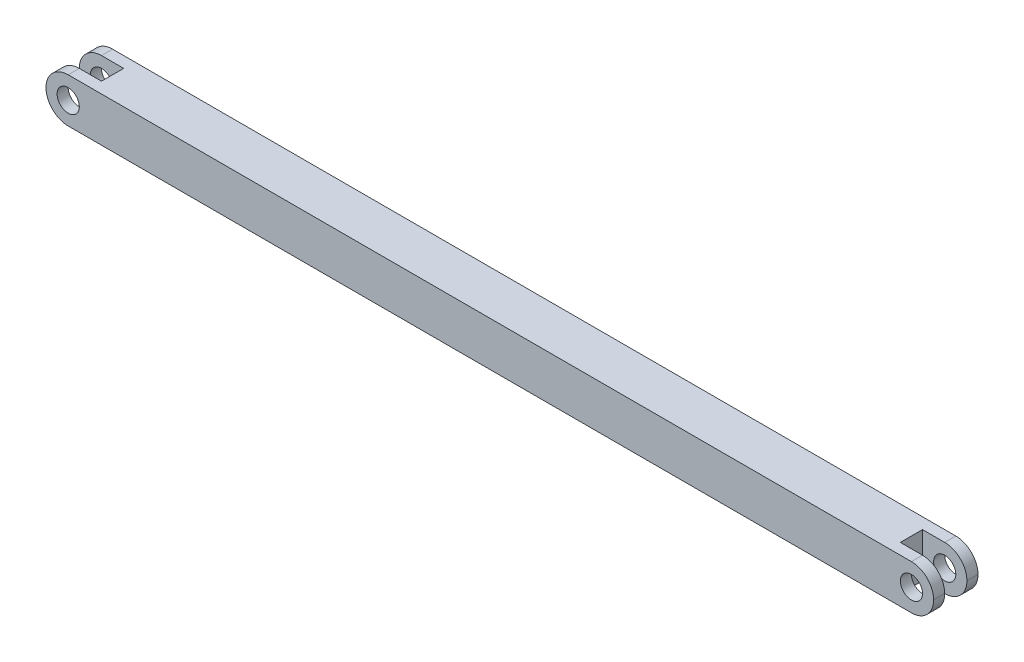
ISO-10303-21;
HEADER;
FILE_DESCRIPTION(('STEP AP214'),'2;1');
FILE_NAME('part.step','',(''),(''),'','','');
FILE_SCHEMA(('AUTOMOTIVE_DESIGN { 1 0 10303 214 1 1 1 1 }'));
ENDSEC;
DATA;
#1=APPLICATION_CONTEXT('core data for automotive mechanical design processes');
#2=APPLICATION_PROTOCOL_DEFINITION('international standard','automotive_design',2000,#1);
#3=PRODUCT_CONTEXT('',#1,'mechanical');
#4=PRODUCT('Part','Part','',(#3));
#5=PRODUCT_RELATED_PRODUCT_CATEGORY('part','',(#4));
#6=PRODUCT_DEFINITION_FORMATION('','',#4);
#7=PRODUCT_DEFINITION_CONTEXT('part definition',#1,'design');
#8=PRODUCT_DEFINITION('design','',#6,#7);
#9=PRODUCT_DEFINITION_SHAPE('','',#8);
#10=(LENGTH_UNIT() NAMED_UNIT(*) SI_UNIT(.MILLI.,.METRE.));
#11=(NAMED_UNIT(*) PLANE_ANGLE_UNIT() SI_UNIT($,.RADIAN.));
#12=(NAMED_UNIT(*) SI_UNIT($,.STERADIAN.) SOLID_ANGLE_UNIT());
#13=UNCERTAINTY_MEASURE_WITH_UNIT(LENGTH_MEASURE(1.E-05),#10,'distance_accuracy_value','');
#14=(GEOMETRIC_REPRESENTATION_CONTEXT(3) GLOBAL_UNCERTAINTY_ASSIGNED_CONTEXT((#13)) GLOBAL_UNIT_ASSIGNED_CONTEXT((#10,
#11,#12)) REPRESENTATION_CONTEXT('',''));
#15=CARTESIAN_POINT('',(0.,0.,0.));
#16=DIRECTION('',(0.,0.,1.));
#17=DIRECTION('',(1.,0.,0.));
#18=AXIS2_PLACEMENT_3D('',#15,#16,#17);
#19=CARTESIAN_POINT('',(-95.,0.,10.));
#20=DIRECTION('',(0.,0.,-1.));
#21=DIRECTION('',(-1.,0.,0.));
#22=AXIS2_PLACEMENT_3D('',#19,#20,#21);
#23=CYLINDRICAL_SURFACE('',#22,5.);
#24=CARTESIAN_POINT('',(-95.,0.,2.5));
#25=DIRECTION('',(0.,0.,-1.));
#26=DIRECTION('',(-1.,0.,0.));
#27=AXIS2_PLACEMENT_3D('',#24,#25,#26);
#28=CIRCLE('',#27,5.);
#29=CARTESIAN_POINT('',(-95.,5.,2.5));
#30=VERTEX_POINT('',#29);
#31=CARTESIAN_POINT('',(-100.,0.,2.5));
#32=VERTEX_POINT('',#31);
#33=EDGE_CURVE('E216',#30,#32,#28,.F.);
#34=ORIENTED_EDGE('',*,*,#33,.F.);
#35=DIRECTION('',(0.,0.,-1.));
#36=VECTOR('',#35,1.);
#37=CARTESIAN_POINT('',(-95.,5.,10.));
#38=LINE('',#37,#36);
#39=CARTESIAN_POINT('',(-95.,5.,0.));
#40=VERTEX_POINT('',#39);
#41=EDGE_CURVE('E11',#40,#30,#38,.F.);
#42=ORIENTED_EDGE('',*,*,#41,.F.);
#43=CARTESIAN_POINT('',(-95.,0.,0.));
#44=DIRECTION('',(0.,0.,1.));
#45=DIRECTION('',(1.,0.,0.));
#46=AXIS2_PLACEMENT_3D('',#43,#44,#45);
#47=CIRCLE('',#46,5.);
#48=CARTESIAN_POINT('',(-100.,0.,0.));
#49=VERTEX_POINT('',#48);
#50=EDGE_CURVE('E254',#49,#40,#47,.F.);
#51=ORIENTED_EDGE('',*,*,#50,.F.);
#52=DIRECTION('',(0.,0.,-1.));
#53=VECTOR('',#52,1.);
#54=CARTESIAN_POINT('',(-100.,0.,10.));
#55=LINE('',#54,#53);
#56=EDGE_CURVE('E274',#32,#49,#55,.T.);
#57=ORIENTED_EDGE('',*,*,#56,.F.);
#58=EDGE_LOOP('',(#34,#42,#51,#57));
#59=FACE_BOUND('',#58,.T.);
#60=ADVANCED_FACE('F33',(#59),#23,.T.);
#61=CARTESIAN_POINT('',(-95.,0.,10.));
#62=DIRECTION('',(0.,0.,-1.));
#63=DIRECTION('',(-1.,0.,0.));
#64=AXIS2_PLACEMENT_3D('',#61,#62,#63);
#65=CYLINDRICAL_SURFACE('',#64,5.);
#66=CARTESIAN_POINT('',(-95.,0.,2.5));
#67=DIRECTION('',(0.,0.,-1.));
#68=DIRECTION('',(-1.,0.,0.));
#69=AXIS2_PLACEMENT_3D('',#66,#67,#68);
#70=CIRCLE('',#69,5.);
#71=CARTESIAN_POINT('',(-95.,-5.,2.5));
#72=VERTEX_POINT('',#71);
#73=EDGE_CURVE('E214',#32,#72,#70,.F.);
#74=ORIENTED_EDGE('',*,*,#73,.F.);
#75=ORIENTED_EDGE('',*,*,#56,.T.);
#76=CARTESIAN_POINT('',(-95.,0.,0.));
#77=DIRECTION('',(0.,0.,1.));
#78=DIRECTION('',(1.,0.,0.));
#79=AXIS2_PLACEMENT_3D('',#76,#77,#78);
#80=CIRCLE('',#79,5.);
#81=CARTESIAN_POINT('',(-95.,-5.,0.));
#82=VERTEX_POINT('',#81);
#83=EDGE_CURVE('E256',#82,#49,#80,.F.);
#84=ORIENTED_EDGE('',*,*,#83,.F.);
#85=DIRECTION('',(0.,0.,-1.));
#86=VECTOR('',#85,1.);
#87=CARTESIAN_POINT('',(-95.,-5.,10.));
#88=LINE('',#87,#86);
#89=EDGE_CURVE('E248',#72,#82,#88,.T.);
#90=ORIENTED_EDGE('',*,*,#89,.F.);
#91=EDGE_LOOP('',(#74,#75,#84,#90));
#92=FACE_BOUND('',#91,.T.);
#93=ADVANCED_FACE('F299',(#92),#65,.T.);
#94=CARTESIAN_POINT('',(95.,0.,10.));
#95=DIRECTION('',(0.,0.,-1.));
#96=DIRECTION('',(-1.,0.,0.));
#97=AXIS2_PLACEMENT_3D('',#94,#95,#96);
#98=CYLINDRICAL_SURFACE('',#97,5.);
#99=CARTESIAN_POINT('',(95.,0.,2.50000000000079));
#100=DIRECTION('',(0.,0.,-1.));
#101=DIRECTION('',(-1.,0.,0.));
#102=AXIS2_PLACEMENT_3D('',#99,#100,#101);
#103=CIRCLE('',#102,5.);
#104=CARTESIAN_POINT('',(100.,0.,2.50000000000083));
#105=VERTEX_POINT('',#104);
#106=CARTESIAN_POINT('',(95.,5.,2.50000000000079));
#107=VERTEX_POINT('',#106);
#108=EDGE_CURVE('E207',#105,#107,#103,.F.);
#109=ORIENTED_EDGE('',*,*,#108,.F.);
#110=DIRECTION('',(0.,0.,-1.));
#111=VECTOR('',#110,1.);
#112=CARTESIAN_POINT('',(100.,0.,10.));
#113=LINE('',#112,#111);
#114=CARTESIAN_POINT('',(100.,0.,0.));
#115=VERTEX_POINT('',#114);
#116=EDGE_CURVE('E275',#115,#105,#113,.F.);
#117=ORIENTED_EDGE('',*,*,#116,.F.);
#118=CARTESIAN_POINT('',(95.,0.,0.));
#119=DIRECTION('',(0.,0.,1.));
#120=DIRECTION('',(1.,0.,0.));
#121=AXIS2_PLACEMENT_3D('',#118,#119,#120);
#122=CIRCLE('',#121,5.);
#123=CARTESIAN_POINT('',(94.9999999999999,5.,0.));
#124=VERTEX_POINT('',#123);
#125=EDGE_CURVE('E250',#124,#115,#122,.F.);
#126=ORIENTED_EDGE('',*,*,#125,.F.);
#127=DIRECTION('',(0.,0.,-1.));
#128=VECTOR('',#127,1.);
#129=CARTESIAN_POINT('',(95.,5.,10.));
#130=LINE('',#129,#128);
#131=EDGE_CURVE('E268',#107,#124,#130,.T.);
#132=ORIENTED_EDGE('',*,*,#131,.F.);
#133=EDGE_LOOP('',(#109,#117,#126,#132));
#134=FACE_BOUND('',#133,.T.);
#135=ADVANCED_FACE('F306',(#134),#98,.T.);
#136=CARTESIAN_POINT('',(95.,0.,10.));
#137=DIRECTION('',(0.,0.,-1.));
#138=DIRECTION('',(-1.,0.,0.));
#139=AXIS2_PLACEMENT_3D('',#136,#137,#138);
#140=CYLINDRICAL_SURFACE('',#139,5.);
#141=CARTESIAN_POINT('',(95.,0.,2.50000000000079));
#142=DIRECTION('',(0.,0.,-1.));
#143=DIRECTION('',(-1.,0.,0.));
#144=AXIS2_PLACEMENT_3D('',#141,#142,#143);
#145=CIRCLE('',#144,5.);
#146=CARTESIAN_POINT('',(95.,-5.,2.50000000000079));
#147=VERTEX_POINT('',#146);
#148=EDGE_CURVE('E205',#147,#105,#145,.F.);
#149=ORIENTED_EDGE('',*,*,#148,.F.);
#150=DIRECTION('',(0.,0.,-1.));
#151=VECTOR('',#150,1.);
#152=CARTESIAN_POINT('',(95.,-5.,10.));
#153=LINE('',#152,#151);
#154=CARTESIAN_POINT('',(94.9999999999999,-5.,0.));
#155=VERTEX_POINT('',#154);
#156=EDGE_CURVE('E245',#155,#147,#153,.F.);
#157=ORIENTED_EDGE('',*,*,#156,.F.);
#158=CARTESIAN_POINT('',(95.,0.,0.));
#159=DIRECTION('',(0.,0.,1.));
#160=DIRECTION('',(1.,0.,0.));
#161=AXIS2_PLACEMENT_3D('',#158,#159,#160);
#162=CIRCLE('',#161,5.);
#163=EDGE_CURVE('E252',#115,#155,#162,.F.);
#164=ORIENTED_EDGE('',*,*,#163,.F.);
#165=ORIENTED_EDGE('',*,*,#116,.T.);
#166=EDGE_LOOP('',(#149,#157,#164,#165));
#167=FACE_BOUND('',#166,.T.);
#168=ADVANCED_FACE('F357',(#167),#140,.T.);
#169=CARTESIAN_POINT('',(-95.,0.,0.));
#170=DIRECTION('',(0.,0.,1.));
#171=DIRECTION('',(1.,0.,0.));
#172=AXIS2_PLACEMENT_3D('',#169,#170,#171);
#173=CYLINDRICAL_SURFACE('',#172,2.5);
#174=CARTESIAN_POINT('',(-95.,0.,2.5));
#175=DIRECTION('',(0.,0.,-1.));
#176=DIRECTION('',(-1.,0.,0.));
#177=AXIS2_PLACEMENT_3D('',#174,#175,#176);
#178=CIRCLE('',#177,2.5);
#179=CARTESIAN_POINT('',(-97.5,0.,2.5));
#180=VERTEX_POINT('',#179);
#181=EDGE_CURVE('E37',#180,#180,#178,.F.);
#182=ORIENTED_EDGE('',*,*,#181,.T.);
#183=EDGE_LOOP('',(#182));
#184=FACE_BOUND('',#183,.T.);
#185=CARTESIAN_POINT('',(-95.,0.,0.));
#186=DIRECTION('',(0.,0.,1.));
#187=DIRECTION('',(1.,0.,0.));
#188=AXIS2_PLACEMENT_3D('',#185,#186,#187);
#189=CIRCLE('',#188,2.5);
#190=CARTESIAN_POINT('',(-92.5,0.,0.));
#191=VERTEX_POINT('',#190);
#192=EDGE_CURVE('E226',#191,#191,#189,.T.);
#193=ORIENTED_EDGE('',*,*,#192,.F.);
#194=EDGE_LOOP('',(#193));
#195=FACE_BOUND('',#194,.T.);
#196=ADVANCED_FACE('F387',(#184,#195),#173,.F.);
#197=CARTESIAN_POINT('',(95.,0.,0.));
#198=DIRECTION('',(0.,0.,1.));
#199=DIRECTION('',(1.,0.,0.));
#200=AXIS2_PLACEMENT_3D('',#197,#198,#199);
#201=CYLINDRICAL_SURFACE('',#200,2.5);
#202=CARTESIAN_POINT('',(95.,0.,2.50000000000079));
#203=DIRECTION('',(0.,0.,-1.));
#204=DIRECTION('',(-1.,0.,0.));
#205=AXIS2_PLACEMENT_3D('',#202,#203,#204);
#206=CIRCLE('',#205,2.5);
#207=CARTESIAN_POINT('',(92.5,0.,2.50000000000077));
#208=VERTEX_POINT('',#207);
#209=EDGE_CURVE('E204',#208,#208,#206,.F.);
#210=ORIENTED_EDGE('',*,*,#209,.T.);
#211=EDGE_LOOP('',(#210));
#212=FACE_BOUND('',#211,.T.);
#213=CARTESIAN_POINT('',(95.,0.,0.));
#214=DIRECTION('',(0.,0.,1.));
#215=DIRECTION('',(1.,0.,0.));
#216=AXIS2_PLACEMENT_3D('',#213,#214,#215);
#217=CIRCLE('',#216,2.5);
#218=CARTESIAN_POINT('',(97.5,0.,0.));
#219=VERTEX_POINT('',#218);
#220=EDGE_CURVE('E219',#219,#219,#217,.T.);
#221=ORIENTED_EDGE('',*,*,#220,.F.);
#222=EDGE_LOOP('',(#221));
#223=FACE_BOUND('',#222,.T.);
#224=ADVANCED_FACE('F378',(#212,#223),#201,.F.);
#225=CARTESIAN_POINT('',(-100.,5.,10.));
#226=DIRECTION('',(0.,-1.,0.));
#227=DIRECTION('',(0.,0.,-1.));
#228=AXIS2_PLACEMENT_3D('',#225,#226,#227);
#229=PLANE('',#228);
#230=ORIENTED_EDGE('',*,*,#41,.T.);
#231=DIRECTION('',(-1.,0.,0.));
#232=VECTOR('',#231,1.);
#233=CARTESIAN_POINT('',(-100.,5.,2.5));
#234=LINE('',#233,#232);
#235=CARTESIAN_POINT('',(-90.,5.,2.5));
#236=VERTEX_POINT('',#235);
#237=EDGE_CURVE('E170',#236,#30,#234,.T.);
#238=ORIENTED_EDGE('',*,*,#237,.F.);
#239=DIRECTION('',(0.,0.,-1.));
#240=VECTOR('',#239,1.);
#241=CARTESIAN_POINT('',(-90.,5.,2.5));
#242=LINE('',#241,#240);
#243=CARTESIAN_POINT('',(-90.,5.,7.5));
#244=VERTEX_POINT('',#243);
#245=EDGE_CURVE('E172',#244,#236,#242,.T.);
#246=ORIENTED_EDGE('',*,*,#245,.F.);
#247=DIRECTION('',(1.,0.,0.));
#248=VECTOR('',#247,1.);
#249=CARTESIAN_POINT('',(-100.,5.,7.5));
#250=LINE('',#249,#248);
#251=CARTESIAN_POINT('',(-95.,5.,7.5));
#252=VERTEX_POINT('',#251);
#253=EDGE_CURVE('E151',#252,#244,#250,.T.);
#254=ORIENTED_EDGE('',*,*,#253,.F.);
#255=CARTESIAN_POINT('',(-95.,5.,10.));
#256=VERTEX_POINT('',#255);
#257=EDGE_CURVE('E42',#252,#256,#38,.F.);
#258=ORIENTED_EDGE('',*,*,#257,.T.);
#259=DIRECTION('',(-1.,0.,0.));
#260=VECTOR('',#259,1.);
#261=CARTESIAN_POINT('',(-100.,5.,10.));
#262=LINE('',#261,#260);
#263=CARTESIAN_POINT('',(94.9999999999999,5.,10.));
#264=VERTEX_POINT('',#263);
#265=EDGE_CURVE('E231',#264,#256,#262,.T.);
#266=ORIENTED_EDGE('',*,*,#265,.F.);
#267=CARTESIAN_POINT('',(95.,5.,7.50000000000079));
#268=VERTEX_POINT('',#267);
#269=EDGE_CURVE('E269',#264,#268,#130,.T.);
#270=ORIENTED_EDGE('',*,*,#269,.T.);
#271=DIRECTION('',(1.,0.,0.));
#272=VECTOR('',#271,1.);
#273=CARTESIAN_POINT('',(99.9999999999999,5.,7.50000000000083));
#274=LINE('',#273,#272);
#275=CARTESIAN_POINT('',(90.,5.,7.50000000000075));
#276=VERTEX_POINT('',#275);
#277=EDGE_CURVE('E185',#276,#268,#274,.T.);
#278=ORIENTED_EDGE('',*,*,#277,.F.);
#279=DIRECTION('',(0.,0.,1.));
#280=VECTOR('',#279,1.);
#281=CARTESIAN_POINT('',(90.,5.,2.50000000000075));
#282=LINE('',#281,#280);
#283=CARTESIAN_POINT('',(90.,5.,2.50000000000075));
#284=VERTEX_POINT('',#283);
#285=EDGE_CURVE('E194',#284,#276,#282,.T.);
#286=ORIENTED_EDGE('',*,*,#285,.F.);
#287=DIRECTION('',(-1.,0.,0.));
#288=VECTOR('',#287,1.);
#289=CARTESIAN_POINT('',(100.,5.,2.50000000000083));
#290=LINE('',#289,#288);
#291=EDGE_CURVE('E192',#107,#284,#290,.T.);
#292=ORIENTED_EDGE('',*,*,#291,.F.);
#293=ORIENTED_EDGE('',*,*,#131,.T.);
#294=DIRECTION('',(-1.,0.,0.));
#295=VECTOR('',#294,1.);
#296=CARTESIAN_POINT('',(-100.,5.,0.));
#297=LINE('',#296,#295);
#298=EDGE_CURVE('E239',#124,#40,#297,.T.);
#299=ORIENTED_EDGE('',*,*,#298,.T.);
#300=EDGE_LOOP('',(#230,#238,#246,#254,#258,#266,#270,#278,#286,#292,#293,#299));
#301=FACE_BOUND('',#300,.T.);
#302=ADVANCED_FACE('F340',(#301),#229,.F.);
#303=CARTESIAN_POINT('',(-100.,-5.,10.));
#304=DIRECTION('',(0.,1.,0.));
#305=DIRECTION('',(0.,0.,1.));
#306=AXIS2_PLACEMENT_3D('',#303,#304,#305);
#307=PLANE('',#306);
#308=DIRECTION('',(0.,0.,-1.));
#309=VECTOR('',#308,1.);
#310=CARTESIAN_POINT('',(-90.,-5.,2.5));
#311=LINE('',#310,#309);
#312=CARTESIAN_POINT('',(-90.,-5.,7.5));
#313=VERTEX_POINT('',#312);
#314=CARTESIAN_POINT('',(-90.,-5.,2.5));
#315=VERTEX_POINT('',#314);
#316=EDGE_CURVE('E159',#313,#315,#311,.T.);
#317=ORIENTED_EDGE('',*,*,#316,.T.);
#318=DIRECTION('',(-1.,0.,0.));
#319=VECTOR('',#318,1.);
#320=CARTESIAN_POINT('',(-100.,-5.,2.5));
#321=LINE('',#320,#319);
#322=EDGE_CURVE('E156',#315,#72,#321,.T.);
#323=ORIENTED_EDGE('',*,*,#322,.T.);
#324=ORIENTED_EDGE('',*,*,#89,.T.);
#325=DIRECTION('',(1.,0.,0.));
#326=VECTOR('',#325,1.);
#327=CARTESIAN_POINT('',(-100.,-5.,0.));
#328=LINE('',#327,#326);
#329=EDGE_CURVE('E235',#82,#155,#328,.T.);
#330=ORIENTED_EDGE('',*,*,#329,.T.);
#331=ORIENTED_EDGE('',*,*,#156,.T.);
#332=DIRECTION('',(-1.,0.,0.));
#333=VECTOR('',#332,1.);
#334=CARTESIAN_POINT('',(100.,-5.,2.50000000000083));
#335=LINE('',#334,#333);
#336=CARTESIAN_POINT('',(90.,-5.,2.50000000000075));
#337=VERTEX_POINT('',#336);
#338=EDGE_CURVE('E181',#147,#337,#335,.T.);
#339=ORIENTED_EDGE('',*,*,#338,.T.);
#340=DIRECTION('',(0.,0.,1.));
#341=VECTOR('',#340,1.);
#342=CARTESIAN_POINT('',(90.,-5.,2.50000000000075));
#343=LINE('',#342,#341);
#344=CARTESIAN_POINT('',(90.,-5.,7.50000000000075));
#345=VERTEX_POINT('',#344);
#346=EDGE_CURVE('E184',#337,#345,#343,.T.);
#347=ORIENTED_EDGE('',*,*,#346,.T.);
#348=DIRECTION('',(1.,0.,0.));
#349=VECTOR('',#348,1.);
#350=CARTESIAN_POINT('',(99.9999999999999,-5.,7.50000000000083));
#351=LINE('',#350,#349);
#352=CARTESIAN_POINT('',(95.,-5.,7.50000000000079));
#353=VERTEX_POINT('',#352);
#354=EDGE_CURVE('E188',#345,#353,#351,.T.);
#355=ORIENTED_EDGE('',*,*,#354,.T.);
#356=CARTESIAN_POINT('',(94.9999999999999,-5.,10.));
#357=VERTEX_POINT('',#356);
#358=EDGE_CURVE('E238',#353,#357,#153,.F.);
#359=ORIENTED_EDGE('',*,*,#358,.T.);
#360=DIRECTION('',(1.,0.,0.));
#361=VECTOR('',#360,1.);
#362=CARTESIAN_POINT('',(-100.,-5.,10.));
#363=LINE('',#362,#361);
#364=CARTESIAN_POINT('',(-95.,-5.,10.));
#365=VERTEX_POINT('',#364);
#366=EDGE_CURVE('E234',#365,#357,#363,.T.);
#367=ORIENTED_EDGE('',*,*,#366,.F.);
#368=CARTESIAN_POINT('',(-95.,-5.,7.5));
#369=VERTEX_POINT('',#368);
#370=EDGE_CURVE('E169',#365,#369,#88,.T.);
#371=ORIENTED_EDGE('',*,*,#370,.T.);
#372=DIRECTION('',(1.,0.,0.));
#373=VECTOR('',#372,1.);
#374=CARTESIAN_POINT('',(-100.,-5.,7.5));
#375=LINE('',#374,#373);
#376=EDGE_CURVE('E50',#369,#313,#375,.T.);
#377=ORIENTED_EDGE('',*,*,#376,.T.);
#378=EDGE_LOOP('',(#317,#323,#324,#330,#331,#339,#347,#355,#359,#367,#371,#377));
#379=FACE_BOUND('',#378,.T.);
#380=ADVANCED_FACE('F166',(#379),#307,.F.);
#381=CARTESIAN_POINT('',(0.,0.,10.));
#382=DIRECTION('',(0.,0.,1.));
#383=DIRECTION('',(1.,0.,0.));
#384=AXIS2_PLACEMENT_3D('',#381,#382,#383);
#385=PLANE('',#384);
#386=CARTESIAN_POINT('',(95.,0.,10.));
#387=DIRECTION('',(0.,0.,1.));
#388=DIRECTION('',(1.,0.,0.));
#389=AXIS2_PLACEMENT_3D('',#386,#387,#388);
#390=CIRCLE('',#389,2.5);
#391=CARTESIAN_POINT('',(97.5,0.,10.));
#392=VERTEX_POINT('',#391);
#393=EDGE_CURVE('E223',#392,#392,#390,.T.);
#394=ORIENTED_EDGE('',*,*,#393,.F.);
#395=EDGE_LOOP('',(#394));
#396=FACE_BOUND('',#395,.T.);
#397=CARTESIAN_POINT('',(-95.,0.,10.));
#398=DIRECTION('',(0.,0.,1.));
#399=DIRECTION('',(1.,0.,0.));
#400=AXIS2_PLACEMENT_3D('',#397,#398,#399);
#401=CIRCLE('',#400,2.5);
#402=CARTESIAN_POINT('',(-92.5,0.,10.));
#403=VERTEX_POINT('',#402);
#404=EDGE_CURVE('E218',#403,#403,#401,.T.);
#405=ORIENTED_EDGE('',*,*,#404,.F.);
#406=EDGE_LOOP('',(#405));
#407=FACE_BOUND('',#406,.T.);
#408=CARTESIAN_POINT('',(-95.,0.,10.));
#409=DIRECTION('',(0.,0.,1.));
#410=DIRECTION('',(1.,0.,0.));
#411=AXIS2_PLACEMENT_3D('',#408,#409,#410);
#412=CIRCLE('',#411,5.);
#413=CARTESIAN_POINT('',(-100.,0.,10.));
#414=VERTEX_POINT('',#413);
#415=EDGE_CURVE('E264',#256,#414,#412,.T.);
#416=ORIENTED_EDGE('',*,*,#415,.T.);
#417=CARTESIAN_POINT('',(-95.,0.,10.));
#418=DIRECTION('',(0.,0.,1.));
#419=DIRECTION('',(1.,0.,0.));
#420=AXIS2_PLACEMENT_3D('',#417,#418,#419);
#421=CIRCLE('',#420,5.);
#422=EDGE_CURVE('E266',#414,#365,#421,.T.);
#423=ORIENTED_EDGE('',*,*,#422,.T.);
#424=ORIENTED_EDGE('',*,*,#366,.T.);
#425=CARTESIAN_POINT('',(95.,0.,10.));
#426=DIRECTION('',(0.,0.,1.));
#427=DIRECTION('',(1.,0.,0.));
#428=AXIS2_PLACEMENT_3D('',#425,#426,#427);
#429=CIRCLE('',#428,5.);
#430=CARTESIAN_POINT('',(100.,0.,10.));
#431=VERTEX_POINT('',#430);
#432=EDGE_CURVE('E261',#357,#431,#429,.T.);
#433=ORIENTED_EDGE('',*,*,#432,.T.);
#434=CARTESIAN_POINT('',(95.,0.,10.));
#435=DIRECTION('',(0.,0.,1.));
#436=DIRECTION('',(1.,0.,0.));
#437=AXIS2_PLACEMENT_3D('',#434,#435,#436);
#438=CIRCLE('',#437,5.);
#439=EDGE_CURVE('E259',#431,#264,#438,.T.);
#440=ORIENTED_EDGE('',*,*,#439,.T.);
#441=ORIENTED_EDGE('',*,*,#265,.T.);
#442=EDGE_LOOP('',(#416,#423,#424,#433,#440,#441));
#443=FACE_BOUND('',#442,.T.);
#444=ADVANCED_FACE('F319',(#396,#407,#443),#385,.T.);
#445=CARTESIAN_POINT('',(0.,0.,0.));
#446=DIRECTION('',(0.,0.,1.));
#447=DIRECTION('',(1.,0.,0.));
#448=AXIS2_PLACEMENT_3D('',#445,#446,#447);
#449=PLANE('',#448);
#450=ORIENTED_EDGE('',*,*,#220,.T.);
#451=EDGE_LOOP('',(#450));
#452=FACE_BOUND('',#451,.T.);
#453=ORIENTED_EDGE('',*,*,#192,.T.);
#454=EDGE_LOOP('',(#453));
#455=FACE_BOUND('',#454,.T.);
#456=ORIENTED_EDGE('',*,*,#329,.F.);
#457=ORIENTED_EDGE('',*,*,#83,.T.);
#458=ORIENTED_EDGE('',*,*,#50,.T.);
#459=ORIENTED_EDGE('',*,*,#298,.F.);
#460=ORIENTED_EDGE('',*,*,#125,.T.);
#461=ORIENTED_EDGE('',*,*,#163,.T.);
#462=EDGE_LOOP('',(#456,#457,#458,#459,#460,#461));
#463=FACE_BOUND('',#462,.T.);
#464=ADVANCED_FACE('F312',(#452,#455,#463),#449,.F.);
#465=CARTESIAN_POINT('',(-95.,0.,7.5));
#466=DIRECTION('',(0.,0.,1.));
#467=DIRECTION('',(1.,0.,0.));
#468=AXIS2_PLACEMENT_3D('',#465,#466,#467);
#469=CIRCLE('',#468,5.);
#470=CARTESIAN_POINT('',(-100.,0.,7.5));
#471=VERTEX_POINT('',#470);
#472=EDGE_CURVE('E212',#471,#252,#469,.F.);
#473=ORIENTED_EDGE('',*,*,#472,.F.);
#474=EDGE_CURVE('E242',#414,#471,#55,.T.);
#475=ORIENTED_EDGE('',*,*,#474,.F.);
#476=ORIENTED_EDGE('',*,*,#415,.F.);
#477=ORIENTED_EDGE('',*,*,#257,.F.);
#478=EDGE_LOOP('',(#473,#475,#476,#477));
#479=FACE_BOUND('',#478,.T.);
#480=ADVANCED_FACE('F302',(#479),#23,.T.);
#481=CARTESIAN_POINT('',(-95.,0.,7.5));
#482=DIRECTION('',(0.,0.,1.));
#483=DIRECTION('',(1.,0.,0.));
#484=AXIS2_PLACEMENT_3D('',#481,#482,#483);
#485=CIRCLE('',#484,5.);
#486=EDGE_CURVE('E210',#369,#471,#485,.F.);
#487=ORIENTED_EDGE('',*,*,#486,.F.);
#488=ORIENTED_EDGE('',*,*,#370,.F.);
#489=ORIENTED_EDGE('',*,*,#422,.F.);
#490=ORIENTED_EDGE('',*,*,#474,.T.);
#491=EDGE_LOOP('',(#487,#488,#489,#490));
#492=FACE_BOUND('',#491,.T.);
#493=ADVANCED_FACE('F309',(#492),#65,.T.);
#494=CARTESIAN_POINT('',(95.,0.,7.50000000000079));
#495=DIRECTION('',(0.,0.,1.));
#496=DIRECTION('',(1.,0.,0.));
#497=AXIS2_PLACEMENT_3D('',#494,#495,#496);
#498=CIRCLE('',#497,5.);
#499=CARTESIAN_POINT('',(100.,0.,7.50000000000083));
#500=VERTEX_POINT('',#499);
#501=EDGE_CURVE('E58',#268,#500,#498,.F.);
#502=ORIENTED_EDGE('',*,*,#501,.F.);
#503=ORIENTED_EDGE('',*,*,#269,.F.);
#504=ORIENTED_EDGE('',*,*,#439,.F.);
#505=EDGE_CURVE('E222',#500,#431,#113,.F.);
#506=ORIENTED_EDGE('',*,*,#505,.F.);
#507=EDGE_LOOP('',(#502,#503,#504,#506));
#508=FACE_BOUND('',#507,.T.);
#509=ADVANCED_FACE('F35',(#508),#98,.T.);
#510=CARTESIAN_POINT('',(95.,0.,7.50000000000079));
#511=DIRECTION('',(0.,0.,1.));
#512=DIRECTION('',(1.,0.,0.));
#513=AXIS2_PLACEMENT_3D('',#510,#511,#512);
#514=CIRCLE('',#513,5.);
#515=EDGE_CURVE('E201',#500,#353,#514,.F.);
#516=ORIENTED_EDGE('',*,*,#515,.F.);
#517=ORIENTED_EDGE('',*,*,#505,.T.);
#518=ORIENTED_EDGE('',*,*,#432,.F.);
#519=ORIENTED_EDGE('',*,*,#358,.F.);
#520=EDGE_LOOP('',(#516,#517,#518,#519));
#521=FACE_BOUND('',#520,.T.);
#522=ADVANCED_FACE('F332',(#521),#140,.T.);
#523=CARTESIAN_POINT('',(-95.,0.,7.5));
#524=DIRECTION('',(0.,0.,1.));
#525=DIRECTION('',(1.,0.,0.));
#526=AXIS2_PLACEMENT_3D('',#523,#524,#525);
#527=CIRCLE('',#526,2.5);
#528=CARTESIAN_POINT('',(-92.5,0.,7.5));
#529=VERTEX_POINT('',#528);
#530=EDGE_CURVE('E209',#529,#529,#527,.F.);
#531=ORIENTED_EDGE('',*,*,#530,.T.);
#532=EDGE_LOOP('',(#531));
#533=FACE_BOUND('',#532,.T.);
#534=ORIENTED_EDGE('',*,*,#404,.T.);
#535=EDGE_LOOP('',(#534));
#536=FACE_BOUND('',#535,.T.);
#537=ADVANCED_FACE('F284',(#533,#536),#173,.F.);
#538=CARTESIAN_POINT('',(95.,0.,7.50000000000079));
#539=DIRECTION('',(0.,0.,1.));
#540=DIRECTION('',(1.,0.,0.));
#541=AXIS2_PLACEMENT_3D('',#538,#539,#540);
#542=CIRCLE('',#541,2.5);
#543=CARTESIAN_POINT('',(97.5,0.,7.50000000000081));
#544=VERTEX_POINT('',#543);
#545=EDGE_CURVE('E179',#544,#544,#542,.F.);
#546=ORIENTED_EDGE('',*,*,#545,.T.);
#547=EDGE_LOOP('',(#546));
#548=FACE_BOUND('',#547,.T.);
#549=ORIENTED_EDGE('',*,*,#393,.T.);
#550=EDGE_LOOP('',(#549));
#551=FACE_BOUND('',#550,.T.);
#552=ADVANCED_FACE('F374',(#548,#551),#201,.F.);
#553=CARTESIAN_POINT('',(100.,-5.,2.50000000000083));
#554=DIRECTION('',(0.,0.,-1.));
#555=DIRECTION('',(-1.,0.,0.));
#556=AXIS2_PLACEMENT_3D('',#553,#554,#555);
#557=PLANE('',#556);
#558=ORIENTED_EDGE('',*,*,#108,.T.);
#559=ORIENTED_EDGE('',*,*,#291,.T.);
#560=DIRECTION('',(0.,1.,0.));
#561=VECTOR('',#560,1.);
#562=CARTESIAN_POINT('',(90.,-5.,2.50000000000075));
#563=LINE('',#562,#561);
#564=EDGE_CURVE('E191',#337,#284,#563,.T.);
#565=ORIENTED_EDGE('',*,*,#564,.F.);
#566=ORIENTED_EDGE('',*,*,#338,.F.);
#567=ORIENTED_EDGE('',*,*,#148,.T.);
#568=EDGE_LOOP('',(#558,#559,#565,#566,#567));
#569=FACE_BOUND('',#568,.T.);
#570=ORIENTED_EDGE('',*,*,#209,.F.);
#571=EDGE_LOOP('',(#570));
#572=FACE_BOUND('',#571,.T.);
#573=ADVANCED_FACE('F361',(#569,#572),#557,.F.);
#574=CARTESIAN_POINT('',(99.9999999999999,-5.,7.50000000000083));
#575=DIRECTION('',(0.,0.,1.));
#576=DIRECTION('',(1.,0.,0.));
#577=AXIS2_PLACEMENT_3D('',#574,#575,#576);
#578=PLANE('',#577);
#579=ORIENTED_EDGE('',*,*,#501,.T.);
#580=ORIENTED_EDGE('',*,*,#515,.T.);
#581=ORIENTED_EDGE('',*,*,#354,.F.);
#582=DIRECTION('',(0.,1.,0.));
#583=VECTOR('',#582,1.);
#584=CARTESIAN_POINT('',(90.,-5.,7.50000000000075));
#585=LINE('',#584,#583);
#586=EDGE_CURVE('E177',#345,#276,#585,.T.);
#587=ORIENTED_EDGE('',*,*,#586,.T.);
#588=ORIENTED_EDGE('',*,*,#277,.T.);
#589=EDGE_LOOP('',(#579,#580,#581,#587,#588));
#590=FACE_BOUND('',#589,.T.);
#591=ORIENTED_EDGE('',*,*,#545,.F.);
#592=EDGE_LOOP('',(#591));
#593=FACE_BOUND('',#592,.T.);
#594=ADVANCED_FACE('F369',(#590,#593),#578,.F.);
#595=CARTESIAN_POINT('',(90.,-5.,2.50000000000075));
#596=DIRECTION('',(-1.,0.,0.));
#597=DIRECTION('',(0.,0.,1.));
#598=AXIS2_PLACEMENT_3D('',#595,#596,#597);
#599=PLANE('',#598);
#600=ORIENTED_EDGE('',*,*,#285,.T.);
#601=ORIENTED_EDGE('',*,*,#586,.F.);
#602=ORIENTED_EDGE('',*,*,#346,.F.);
#603=ORIENTED_EDGE('',*,*,#564,.T.);
#604=EDGE_LOOP('',(#600,#601,#602,#603));
#605=FACE_BOUND('',#604,.T.);
#606=ADVANCED_FACE('F294',(#605),#599,.F.);
#607=CARTESIAN_POINT('',(-100.,-5.,2.5));
#608=DIRECTION('',(0.,0.,-1.));
#609=DIRECTION('',(-1.,0.,0.));
#610=AXIS2_PLACEMENT_3D('',#607,#608,#609);
#611=PLANE('',#610);
#612=ORIENTED_EDGE('',*,*,#33,.T.);
#613=ORIENTED_EDGE('',*,*,#73,.T.);
#614=ORIENTED_EDGE('',*,*,#322,.F.);
#615=DIRECTION('',(0.,1.,0.));
#616=VECTOR('',#615,1.);
#617=CARTESIAN_POINT('',(-90.,-5.,2.5));
#618=LINE('',#617,#616);
#619=EDGE_CURVE('E155',#315,#236,#618,.T.);
#620=ORIENTED_EDGE('',*,*,#619,.T.);
#621=ORIENTED_EDGE('',*,*,#237,.T.);
#622=EDGE_LOOP('',(#612,#613,#614,#620,#621));
#623=FACE_BOUND('',#622,.T.);
#624=ORIENTED_EDGE('',*,*,#181,.F.);
#625=EDGE_LOOP('',(#624));
#626=FACE_BOUND('',#625,.T.);
#627=ADVANCED_FACE('F287',(#623,#626),#611,.F.);
#628=CARTESIAN_POINT('',(-100.,-5.,7.5));
#629=DIRECTION('',(0.,0.,1.));
#630=DIRECTION('',(1.,0.,0.));
#631=AXIS2_PLACEMENT_3D('',#628,#629,#630);
#632=PLANE('',#631);
#633=ORIENTED_EDGE('',*,*,#472,.T.);
#634=ORIENTED_EDGE('',*,*,#253,.T.);
#635=DIRECTION('',(0.,1.,0.));
#636=VECTOR('',#635,1.);
#637=CARTESIAN_POINT('',(-90.,-5.,7.5));
#638=LINE('',#637,#636);
#639=EDGE_CURVE('E146',#313,#244,#638,.T.);
#640=ORIENTED_EDGE('',*,*,#639,.F.);
#641=ORIENTED_EDGE('',*,*,#376,.F.);
#642=ORIENTED_EDGE('',*,*,#486,.T.);
#643=EDGE_LOOP('',(#633,#634,#640,#641,#642));
#644=FACE_BOUND('',#643,.T.);
#645=ORIENTED_EDGE('',*,*,#530,.F.);
#646=EDGE_LOOP('',(#645));
#647=FACE_BOUND('',#646,.T.);
#648=ADVANCED_FACE('F148',(#644,#647),#632,.F.);
#649=CARTESIAN_POINT('',(-90.,-5.,2.5));
#650=DIRECTION('',(1.,0.,0.));
#651=DIRECTION('',(0.,0.,-1.));
#652=AXIS2_PLACEMENT_3D('',#649,#650,#651);
#653=PLANE('',#652);
#654=ORIENTED_EDGE('',*,*,#245,.T.);
#655=ORIENTED_EDGE('',*,*,#619,.F.);
#656=ORIENTED_EDGE('',*,*,#316,.F.);
#657=ORIENTED_EDGE('',*,*,#639,.T.);
#658=EDGE_LOOP('',(#654,#655,#656,#657));
#659=FACE_BOUND('',#658,.T.);
#660=ADVANCED_FACE('F160',(#659),#653,.F.);
#661=CLOSED_SHELL('',(#60,#93,#135,#168,#196,#224,#302,#380,#444,#464,#480,#493,#509,#522,#537,
#552,#573,#594,#606,#627,#648,#660));
#662=MANIFOLD_SOLID_BREP('B2',#661);
#663=ADVANCED_BREP_SHAPE_REPRESENTATION('',(#18,#662),#14);
#664=SHAPE_DEFINITION_REPRESENTATION(#9,#663);
ENDSEC;
END-ISO-10303-21;
